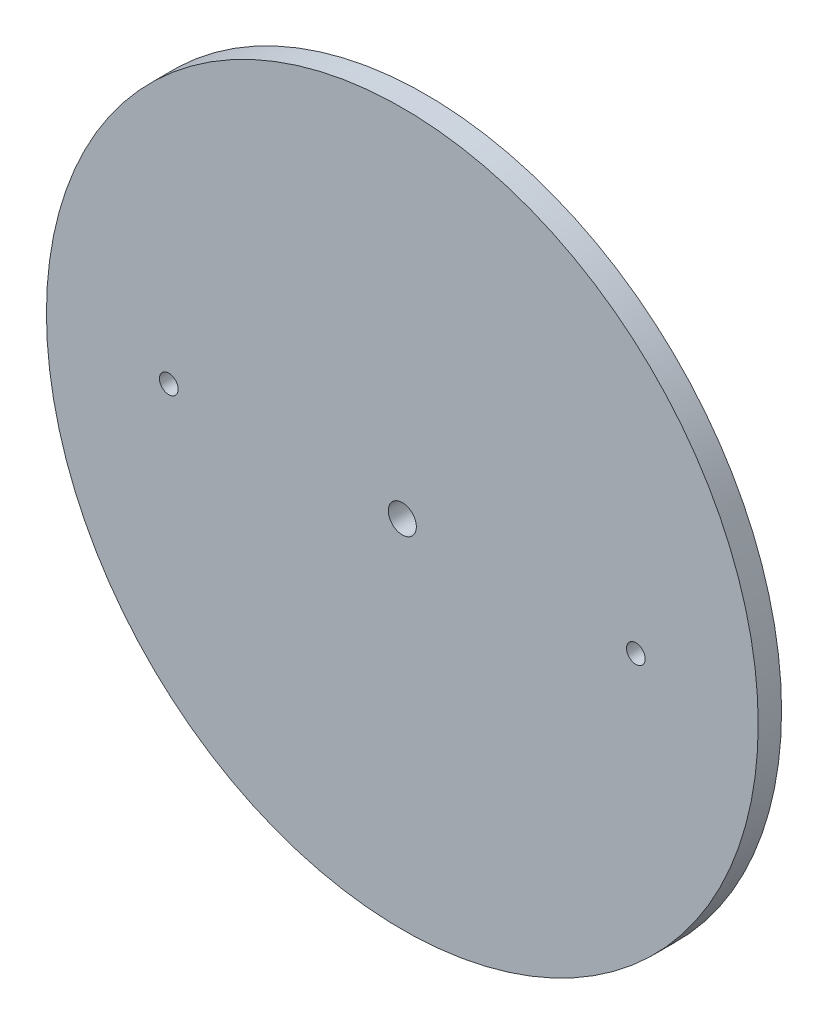
ISO-10303-21;
HEADER;
FILE_DESCRIPTION(('STEP AP214'),'2;1');
FILE_NAME('part.step','',(''),(''),'','','');
FILE_SCHEMA(('AUTOMOTIVE_DESIGN { 1 0 10303 214 1 1 1 1 }'));
ENDSEC;
DATA;
#1=APPLICATION_CONTEXT('core data for automotive mechanical design processes');
#2=APPLICATION_PROTOCOL_DEFINITION('international standard','automotive_design',2000,#1);
#3=PRODUCT_CONTEXT('',#1,'mechanical');
#4=PRODUCT('Part','Part','',(#3));
#5=PRODUCT_RELATED_PRODUCT_CATEGORY('part','',(#4));
#6=PRODUCT_DEFINITION_FORMATION('','',#4);
#7=PRODUCT_DEFINITION_CONTEXT('part definition',#1,'design');
#8=PRODUCT_DEFINITION('design','',#6,#7);
#9=PRODUCT_DEFINITION_SHAPE('','',#8);
#10=(LENGTH_UNIT() NAMED_UNIT(*) SI_UNIT(.MILLI.,.METRE.));
#11=(NAMED_UNIT(*) PLANE_ANGLE_UNIT() SI_UNIT($,.RADIAN.));
#12=(NAMED_UNIT(*) SI_UNIT($,.STERADIAN.) SOLID_ANGLE_UNIT());
#13=UNCERTAINTY_MEASURE_WITH_UNIT(LENGTH_MEASURE(1.E-05),#10,'distance_accuracy_value','');
#14=(GEOMETRIC_REPRESENTATION_CONTEXT(3) GLOBAL_UNCERTAINTY_ASSIGNED_CONTEXT((#13)) GLOBAL_UNIT_ASSIGNED_CONTEXT((#10,
#11,#12)) REPRESENTATION_CONTEXT('',''));
#15=CARTESIAN_POINT('',(0.,0.,0.));
#16=DIRECTION('',(0.,0.,1.));
#17=DIRECTION('',(1.,0.,0.));
#18=AXIS2_PLACEMENT_3D('',#15,#16,#17);
#19=CARTESIAN_POINT('',(0.,0.,0.));
#20=DIRECTION('',(0.,0.,-1.));
#21=DIRECTION('',(-1.,0.,0.));
#22=AXIS2_PLACEMENT_3D('',#19,#20,#21);
#23=CYLINDRICAL_SURFACE('',#22,76.2);
#24=CARTESIAN_POINT('',(0.,0.,0.));
#25=DIRECTION('',(0.,0.,-1.));
#26=DIRECTION('',(1.,0.,0.));
#27=AXIS2_PLACEMENT_3D('',#24,#25,#26);
#28=CIRCLE('',#27,76.2);
#29=CARTESIAN_POINT('',(76.2,0.,0.));
#30=VERTEX_POINT('',#29);
#31=EDGE_CURVE('E10',#30,#30,#28,.T.);
#32=ORIENTED_EDGE('',*,*,#31,.T.);
#33=EDGE_LOOP('',(#32));
#34=FACE_BOUND('',#33,.T.);
#35=CARTESIAN_POINT('',(0.,0.,-5.));
#36=DIRECTION('',(0.,0.,-1.));
#37=DIRECTION('',(1.,0.,0.));
#38=AXIS2_PLACEMENT_3D('',#35,#36,#37);
#39=CIRCLE('',#38,76.2);
#40=CARTESIAN_POINT('',(76.2,0.,-5.));
#41=VERTEX_POINT('',#40);
#42=EDGE_CURVE('E40',#41,#41,#39,.T.);
#43=ORIENTED_EDGE('',*,*,#42,.F.);
#44=EDGE_LOOP('',(#43));
#45=FACE_BOUND('',#44,.T.);
#46=ADVANCED_FACE('F37',(#34,#45),#23,.T.);
#47=CARTESIAN_POINT('',(0.,0.,0.));
#48=DIRECTION('',(0.,0.,1.));
#49=DIRECTION('',(1.,0.,0.));
#50=AXIS2_PLACEMENT_3D('',#47,#48,#49);
#51=PLANE('',#50);
#52=CARTESIAN_POINT('',(0.,0.,0.));
#53=DIRECTION('',(0.,0.,-1.));
#54=DIRECTION('',(1.,0.,0.));
#55=AXIS2_PLACEMENT_3D('',#52,#53,#54);
#56=CIRCLE('',#55,3.);
#57=CARTESIAN_POINT('',(3.,0.,0.));
#58=VERTEX_POINT('',#57);
#59=EDGE_CURVE('E63',#58,#58,#56,.T.);
#60=ORIENTED_EDGE('',*,*,#59,.T.);
#61=EDGE_LOOP('',(#60));
#62=FACE_BOUND('',#61,.T.);
#63=CARTESIAN_POINT('',(50.,0.,0.));
#64=DIRECTION('',(0.,0.,-1.));
#65=DIRECTION('',(1.,0.,0.));
#66=AXIS2_PLACEMENT_3D('',#63,#64,#65);
#67=CIRCLE('',#66,2.);
#68=CARTESIAN_POINT('',(52.,0.,0.));
#69=VERTEX_POINT('',#68);
#70=EDGE_CURVE('E55',#69,#69,#67,.T.);
#71=ORIENTED_EDGE('',*,*,#70,.T.);
#72=EDGE_LOOP('',(#71));
#73=FACE_BOUND('',#72,.T.);
#74=CARTESIAN_POINT('',(-50.,0.,0.));
#75=DIRECTION('',(0.,0.,-1.));
#76=DIRECTION('',(1.,0.,0.));
#77=AXIS2_PLACEMENT_3D('',#74,#75,#76);
#78=CIRCLE('',#77,2.);
#79=CARTESIAN_POINT('',(-48.,0.,0.));
#80=VERTEX_POINT('',#79);
#81=EDGE_CURVE('E49',#80,#80,#78,.T.);
#82=ORIENTED_EDGE('',*,*,#81,.T.);
#83=EDGE_LOOP('',(#82));
#84=FACE_BOUND('',#83,.T.);
#85=ORIENTED_EDGE('',*,*,#31,.F.);
#86=EDGE_LOOP('',(#85));
#87=FACE_BOUND('',#86,.T.);
#88=ADVANCED_FACE('F75',(#62,#73,#84,#87),#51,.T.);
#89=CARTESIAN_POINT('',(0.,0.,-5.));
#90=DIRECTION('',(0.,0.,1.));
#91=DIRECTION('',(1.,0.,0.));
#92=AXIS2_PLACEMENT_3D('',#89,#90,#91);
#93=PLANE('',#92);
#94=CARTESIAN_POINT('',(0.,0.,-5.));
#95=DIRECTION('',(0.,0.,-1.));
#96=DIRECTION('',(1.,0.,0.));
#97=AXIS2_PLACEMENT_3D('',#94,#95,#96);
#98=CIRCLE('',#97,3.);
#99=CARTESIAN_POINT('',(3.,0.,-5.));
#100=VERTEX_POINT('',#99);
#101=EDGE_CURVE('E67',#100,#100,#98,.T.);
#102=ORIENTED_EDGE('',*,*,#101,.F.);
#103=EDGE_LOOP('',(#102));
#104=FACE_BOUND('',#103,.T.);
#105=CARTESIAN_POINT('',(50.,0.,-5.));
#106=DIRECTION('',(0.,0.,-1.));
#107=DIRECTION('',(1.,0.,0.));
#108=AXIS2_PLACEMENT_3D('',#105,#106,#107);
#109=CIRCLE('',#108,2.);
#110=CARTESIAN_POINT('',(52.,0.,-5.));
#111=VERTEX_POINT('',#110);
#112=EDGE_CURVE('E59',#111,#111,#109,.T.);
#113=ORIENTED_EDGE('',*,*,#112,.F.);
#114=EDGE_LOOP('',(#113));
#115=FACE_BOUND('',#114,.T.);
#116=CARTESIAN_POINT('',(-50.,0.,-5.));
#117=DIRECTION('',(0.,0.,-1.));
#118=DIRECTION('',(1.,0.,0.));
#119=AXIS2_PLACEMENT_3D('',#116,#117,#118);
#120=CIRCLE('',#119,2.);
#121=CARTESIAN_POINT('',(-48.,0.,-5.));
#122=VERTEX_POINT('',#121);
#123=EDGE_CURVE('E51',#122,#122,#120,.T.);
#124=ORIENTED_EDGE('',*,*,#123,.F.);
#125=EDGE_LOOP('',(#124));
#126=FACE_BOUND('',#125,.T.);
#127=ORIENTED_EDGE('',*,*,#42,.T.);
#128=EDGE_LOOP('',(#127));
#129=FACE_BOUND('',#128,.T.);
#130=ADVANCED_FACE('F85',(#104,#115,#126,#129),#93,.F.);
#131=CARTESIAN_POINT('',(-50.,0.,0.));
#132=DIRECTION('',(0.,0.,-1.));
#133=DIRECTION('',(-1.,0.,0.));
#134=AXIS2_PLACEMENT_3D('',#131,#132,#133);
#135=CYLINDRICAL_SURFACE('',#134,2.);
#136=ORIENTED_EDGE('',*,*,#81,.F.);
#137=EDGE_LOOP('',(#136));
#138=FACE_BOUND('',#137,.T.);
#139=ORIENTED_EDGE('',*,*,#123,.T.);
#140=EDGE_LOOP('',(#139));
#141=FACE_BOUND('',#140,.T.);
#142=ADVANCED_FACE('F88',(#138,#141),#135,.F.);
#143=CARTESIAN_POINT('',(50.,0.,0.));
#144=DIRECTION('',(0.,0.,-1.));
#145=DIRECTION('',(-1.,0.,0.));
#146=AXIS2_PLACEMENT_3D('',#143,#144,#145);
#147=CYLINDRICAL_SURFACE('',#146,2.);
#148=ORIENTED_EDGE('',*,*,#70,.F.);
#149=EDGE_LOOP('',(#148));
#150=FACE_BOUND('',#149,.T.);
#151=ORIENTED_EDGE('',*,*,#112,.T.);
#152=EDGE_LOOP('',(#151));
#153=FACE_BOUND('',#152,.T.);
#154=ADVANCED_FACE('F81',(#150,#153),#147,.F.);
#155=CARTESIAN_POINT('',(0.,0.,0.));
#156=DIRECTION('',(0.,0.,-1.));
#157=DIRECTION('',(-1.,0.,0.));
#158=AXIS2_PLACEMENT_3D('',#155,#156,#157);
#159=CYLINDRICAL_SURFACE('',#158,3.);
#160=ORIENTED_EDGE('',*,*,#59,.F.);
#161=EDGE_LOOP('',(#160));
#162=FACE_BOUND('',#161,.T.);
#163=ORIENTED_EDGE('',*,*,#101,.T.);
#164=EDGE_LOOP('',(#163));
#165=FACE_BOUND('',#164,.T.);
#166=ADVANCED_FACE('F78',(#162,#165),#159,.F.);
#167=CLOSED_SHELL('',(#46,#88,#130,#142,#154,#166));
#168=MANIFOLD_SOLID_BREP('B2',#167);
#169=ADVANCED_BREP_SHAPE_REPRESENTATION('',(#18,#168),#14);
#170=SHAPE_DEFINITION_REPRESENTATION(#9,#169);
ENDSEC;
END-ISO-10303-21;
